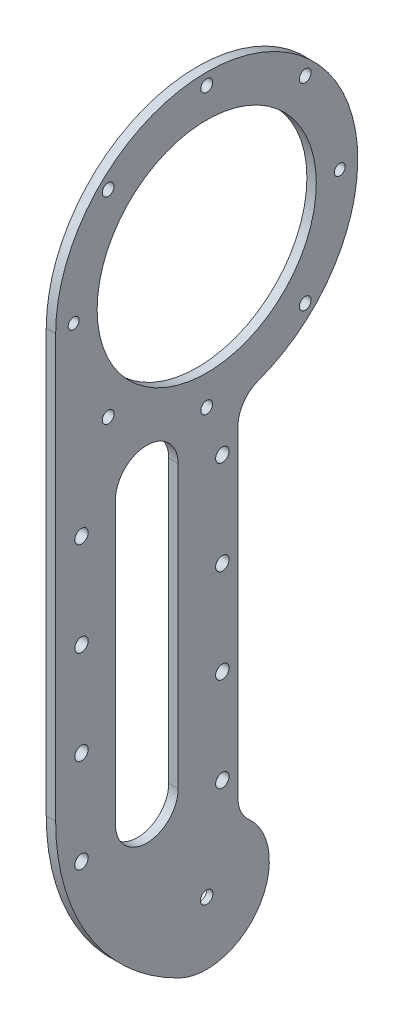
ISO-10303-21;
HEADER;
FILE_DESCRIPTION(('STEP AP214'),'2;1');
FILE_NAME('part.step','',(''),(''),'','','');
FILE_SCHEMA(('AUTOMOTIVE_DESIGN { 1 0 10303 214 1 1 1 1 }'));
ENDSEC;
DATA;
#1=APPLICATION_CONTEXT('core data for automotive mechanical design processes');
#2=APPLICATION_PROTOCOL_DEFINITION('international standard','automotive_design',2000,#1);
#3=PRODUCT_CONTEXT('',#1,'mechanical');
#4=PRODUCT('Part','Part','',(#3));
#5=PRODUCT_RELATED_PRODUCT_CATEGORY('part','',(#4));
#6=PRODUCT_DEFINITION_FORMATION('','',#4);
#7=PRODUCT_DEFINITION_CONTEXT('part definition',#1,'design');
#8=PRODUCT_DEFINITION('design','',#6,#7);
#9=PRODUCT_DEFINITION_SHAPE('','',#8);
#10=(LENGTH_UNIT() NAMED_UNIT(*) SI_UNIT(.MILLI.,.METRE.));
#11=(NAMED_UNIT(*) PLANE_ANGLE_UNIT() SI_UNIT($,.RADIAN.));
#12=(NAMED_UNIT(*) SI_UNIT($,.STERADIAN.) SOLID_ANGLE_UNIT());
#13=UNCERTAINTY_MEASURE_WITH_UNIT(LENGTH_MEASURE(1.E-05),#10,'distance_accuracy_value','');
#14=(GEOMETRIC_REPRESENTATION_CONTEXT(3) GLOBAL_UNCERTAINTY_ASSIGNED_CONTEXT((#13)) GLOBAL_UNIT_ASSIGNED_CONTEXT((#10,
#11,#12)) REPRESENTATION_CONTEXT('',''));
#15=CARTESIAN_POINT('',(0.,0.,0.));
#16=DIRECTION('',(0.,0.,1.));
#17=DIRECTION('',(1.,0.,0.));
#18=AXIS2_PLACEMENT_3D('',#15,#16,#17);
#19=CARTESIAN_POINT('',(-7.,-180.,0.));
#20=DIRECTION('',(1.,0.,0.));
#21=DIRECTION('',(0.,0.,1.));
#22=AXIS2_PLACEMENT_3D('',#19,#20,#21);
#23=CYLINDRICAL_SURFACE('',#22,2.);
#24=CARTESIAN_POINT('',(3.,-180.,0.));
#25=DIRECTION('',(-1.,0.,0.));
#26=DIRECTION('',(0.,0.,1.));
#27=AXIS2_PLACEMENT_3D('',#24,#25,#26);
#28=CIRCLE('',#27,2.);
#29=CARTESIAN_POINT('',(3.,-180.,2.));
#30=VERTEX_POINT('',#29);
#31=EDGE_CURVE('E252',#30,#30,#28,.T.);
#32=ORIENTED_EDGE('',*,*,#31,.F.);
#33=EDGE_LOOP('',(#32));
#34=FACE_BOUND('',#33,.T.);
#35=CARTESIAN_POINT('',(1.,-180.,0.));
#36=DIRECTION('',(1.,0.,0.));
#37=DIRECTION('',(0.,0.,-1.));
#38=AXIS2_PLACEMENT_3D('',#35,#36,#37);
#39=CIRCLE('',#38,2.);
#40=CARTESIAN_POINT('',(1.,-180.,-2.));
#41=VERTEX_POINT('',#40);
#42=EDGE_CURVE('E51',#41,#41,#39,.F.);
#43=ORIENTED_EDGE('',*,*,#42,.T.);
#44=EDGE_LOOP('',(#43));
#45=FACE_BOUND('',#44,.T.);
#46=ADVANCED_FACE('F47',(#34,#45),#23,.F.);
#47=CARTESIAN_POINT('',(3.,0.,0.));
#48=DIRECTION('',(-1.,0.,0.));
#49=DIRECTION('',(0.,0.,-1.));
#50=AXIS2_PLACEMENT_3D('',#47,#48,#49);
#51=CYLINDRICAL_SURFACE('',#50,48.25);
#52=CARTESIAN_POINT('',(0.,0.,0.));
#53=DIRECTION('',(-1.,0.,0.));
#54=DIRECTION('',(0.,0.,1.));
#55=AXIS2_PLACEMENT_3D('',#52,#53,#54);
#56=CIRCLE('',#55,48.25);
#57=CARTESIAN_POINT('',(0.,0.,48.2500000000173));
#58=VERTEX_POINT('',#57);
#59=CARTESIAN_POINT('',(0.,-45.3168047818908,-16.5665236051502));
#60=VERTEX_POINT('',#59);
#61=EDGE_CURVE('E259',#58,#60,#56,.T.);
#62=ORIENTED_EDGE('',*,*,#61,.F.);
#63=DIRECTION('',(1.,0.,0.));
#64=VECTOR('',#63,1.);
#65=CARTESIAN_POINT('',(0.,0.,48.2500000000173));
#66=LINE('',#65,#64);
#67=CARTESIAN_POINT('',(3.,0.,48.2500000000173));
#68=VERTEX_POINT('',#67);
#69=EDGE_CURVE('E240',#58,#68,#66,.T.);
#70=ORIENTED_EDGE('',*,*,#69,.T.);
#71=CARTESIAN_POINT('',(3.,0.,0.));
#72=DIRECTION('',(-1.,0.,0.));
#73=DIRECTION('',(0.,0.,1.));
#74=AXIS2_PLACEMENT_3D('',#71,#72,#73);
#75=CIRCLE('',#74,48.25);
#76=CARTESIAN_POINT('',(3.,-45.3168047818908,-16.5665236051502));
#77=VERTEX_POINT('',#76);
#78=EDGE_CURVE('E304',#68,#77,#75,.T.);
#79=ORIENTED_EDGE('',*,*,#78,.T.);
#80=DIRECTION('',(-1.,0.,0.));
#81=VECTOR('',#80,1.);
#82=CARTESIAN_POINT('',(3.,-45.3168047818908,-16.5665236051502));
#83=LINE('',#82,#81);
#84=EDGE_CURVE('E321',#60,#77,#83,.F.);
#85=ORIENTED_EDGE('',*,*,#84,.F.);
#86=EDGE_LOOP('',(#62,#70,#79,#85));
#87=FACE_BOUND('',#86,.T.);
#88=ADVANCED_FACE('F349',(#87),#51,.T.);
#89=CARTESIAN_POINT('',(3.,0.,0.));
#90=DIRECTION('',(1.,0.,0.));
#91=DIRECTION('',(0.,0.,1.));
#92=AXIS2_PLACEMENT_3D('',#89,#90,#91);
#93=PLANE('',#92);
#94=CARTESIAN_POINT('',(3.,-145.453012475219,19.1250000000087));
#95=DIRECTION('',(-1.,0.,0.));
#96=DIRECTION('',(0.,0.,1.));
#97=AXIS2_PLACEMENT_3D('',#94,#95,#96);
#98=CIRCLE('',#97,10.);
#99=CARTESIAN_POINT('',(3.,-145.453012475219,9.12500000000867));
#100=VERTEX_POINT('',#99);
#101=CARTESIAN_POINT('',(3.,-145.453012475219,29.1250000000087));
#102=VERTEX_POINT('',#101);
#103=EDGE_CURVE('E164',#100,#102,#98,.T.);
#104=ORIENTED_EDGE('',*,*,#103,.T.);
#105=DIRECTION('',(0.,1.,0.));
#106=VECTOR('',#105,1.);
#107=CARTESIAN_POINT('',(3.,0.,29.1250000000087));
#108=LINE('',#107,#106);
#109=CARTESIAN_POINT('',(3.,-55.4530124752191,29.1250000000087));
#110=VERTEX_POINT('',#109);
#111=EDGE_CURVE('E161',#102,#110,#108,.T.);
#112=ORIENTED_EDGE('',*,*,#111,.T.);
#113=CARTESIAN_POINT('',(3.,-55.4530124752191,19.1250000000087));
#114=DIRECTION('',(-1.,0.,0.));
#115=DIRECTION('',(0.,0.,1.));
#116=AXIS2_PLACEMENT_3D('',#113,#114,#115);
#117=CIRCLE('',#116,10.);
#118=CARTESIAN_POINT('',(3.,-55.4530124752191,9.12500000000867));
#119=VERTEX_POINT('',#118);
#120=EDGE_CURVE('E159',#110,#119,#117,.T.);
#121=ORIENTED_EDGE('',*,*,#120,.T.);
#122=DIRECTION('',(0.,-1.,0.));
#123=VECTOR('',#122,1.);
#124=CARTESIAN_POINT('',(3.,0.,9.12500000000867));
#125=LINE('',#124,#123);
#126=EDGE_CURVE('E135',#119,#100,#125,.T.);
#127=ORIENTED_EDGE('',*,*,#126,.T.);
#128=EDGE_LOOP('',(#104,#112,#121,#127));
#129=FACE_BOUND('',#128,.T.);
#130=CARTESIAN_POINT('',(3.,0.,0.));
#131=DIRECTION('',(-1.,0.,0.));
#132=DIRECTION('',(0.,0.,1.));
#133=AXIS2_PLACEMENT_3D('',#130,#131,#132);
#134=CIRCLE('',#133,35.);
#135=CARTESIAN_POINT('',(3.,0.,35.));
#136=VERTEX_POINT('',#135);
#137=EDGE_CURVE('E170',#136,#136,#134,.T.);
#138=ORIENTED_EDGE('',*,*,#137,.T.);
#139=EDGE_LOOP('',(#138));
#140=FACE_BOUND('',#139,.T.);
#141=CARTESIAN_POINT('',(3.,-150.145481745696,40.));
#142=DIRECTION('',(-1.,0.,0.));
#143=DIRECTION('',(0.,0.,1.));
#144=AXIS2_PLACEMENT_3D('',#141,#142,#143);
#145=CIRCLE('',#144,2.15);
#146=CARTESIAN_POINT('',(3.,-150.145481745696,42.15));
#147=VERTEX_POINT('',#146);
#148=EDGE_CURVE('E182',#147,#147,#145,.T.);
#149=ORIENTED_EDGE('',*,*,#148,.T.);
#150=EDGE_LOOP('',(#149));
#151=FACE_BOUND('',#150,.T.);
#152=CARTESIAN_POINT('',(3.,-120.145481745696,-5.00000000000002));
#153=DIRECTION('',(-1.,0.,0.));
#154=DIRECTION('',(0.,0.,1.));
#155=AXIS2_PLACEMENT_3D('',#152,#153,#154);
#156=CIRCLE('',#155,2.15);
#157=CARTESIAN_POINT('',(3.,-120.145481745696,-2.85000000000002));
#158=VERTEX_POINT('',#157);
#159=EDGE_CURVE('E190',#158,#158,#156,.T.);
#160=ORIENTED_EDGE('',*,*,#159,.T.);
#161=EDGE_LOOP('',(#160));
#162=FACE_BOUND('',#161,.T.);
#163=CARTESIAN_POINT('',(3.,-120.145481745696,40.));
#164=DIRECTION('',(-1.,0.,0.));
#165=DIRECTION('',(0.,0.,1.));
#166=AXIS2_PLACEMENT_3D('',#163,#164,#165);
#167=CIRCLE('',#166,2.15);
#168=CARTESIAN_POINT('',(3.,-120.145481745696,42.15));
#169=VERTEX_POINT('',#168);
#170=EDGE_CURVE('E189',#169,#169,#167,.T.);
#171=ORIENTED_EDGE('',*,*,#170,.T.);
#172=EDGE_LOOP('',(#171));
#173=FACE_BOUND('',#172,.T.);
#174=CARTESIAN_POINT('',(3.,-90.1454817456961,-5.00000000000002));
#175=DIRECTION('',(-1.,0.,0.));
#176=DIRECTION('',(0.,0.,1.));
#177=AXIS2_PLACEMENT_3D('',#174,#175,#176);
#178=CIRCLE('',#177,2.15);
#179=CARTESIAN_POINT('',(3.,-90.1454817456961,-2.85000000000002));
#180=VERTEX_POINT('',#179);
#181=EDGE_CURVE('E202',#180,#180,#178,.T.);
#182=ORIENTED_EDGE('',*,*,#181,.T.);
#183=EDGE_LOOP('',(#182));
#184=FACE_BOUND('',#183,.T.);
#185=CARTESIAN_POINT('',(3.,-150.145481745696,-5.00000000000002));
#186=DIRECTION('',(-1.,0.,0.));
#187=DIRECTION('',(0.,0.,1.));
#188=AXIS2_PLACEMENT_3D('',#185,#186,#187);
#189=CIRCLE('',#188,2.15);
#190=CARTESIAN_POINT('',(3.,-150.145481745696,-2.85000000000002));
#191=VERTEX_POINT('',#190);
#192=EDGE_CURVE('E183',#191,#191,#189,.T.);
#193=ORIENTED_EDGE('',*,*,#192,.T.);
#194=EDGE_LOOP('',(#193));
#195=FACE_BOUND('',#194,.T.);
#196=CARTESIAN_POINT('',(3.,-90.1454817456961,40.));
#197=DIRECTION('',(-1.,0.,0.));
#198=DIRECTION('',(0.,0.,1.));
#199=AXIS2_PLACEMENT_3D('',#196,#197,#198);
#200=CIRCLE('',#199,2.15);
#201=CARTESIAN_POINT('',(3.,-90.1454817456961,42.15));
#202=VERTEX_POINT('',#201);
#203=EDGE_CURVE('E201',#202,#202,#200,.T.);
#204=ORIENTED_EDGE('',*,*,#203,.T.);
#205=EDGE_LOOP('',(#204));
#206=FACE_BOUND('',#205,.T.);
#207=CARTESIAN_POINT('',(3.,-60.1454817456961,40.));
#208=DIRECTION('',(-1.,0.,0.));
#209=DIRECTION('',(0.,0.,1.));
#210=AXIS2_PLACEMENT_3D('',#207,#208,#209);
#211=CIRCLE('',#210,2.15);
#212=CARTESIAN_POINT('',(3.,-60.1454817456961,42.15));
#213=VERTEX_POINT('',#212);
#214=EDGE_CURVE('E220',#213,#213,#211,.T.);
#215=ORIENTED_EDGE('',*,*,#214,.T.);
#216=EDGE_LOOP('',(#215));
#217=FACE_BOUND('',#216,.T.);
#218=CARTESIAN_POINT('',(3.,-60.1454817456961,-5.00000000000002));
#219=DIRECTION('',(-1.,0.,0.));
#220=DIRECTION('',(0.,0.,1.));
#221=AXIS2_PLACEMENT_3D('',#218,#219,#220);
#222=CIRCLE('',#221,2.15);
#223=CARTESIAN_POINT('',(3.,-60.1454817456961,-2.85000000000002));
#224=VERTEX_POINT('',#223);
#225=EDGE_CURVE('E223',#224,#224,#222,.T.);
#226=ORIENTED_EDGE('',*,*,#225,.T.);
#227=EDGE_LOOP('',(#226));
#228=FACE_BOUND('',#227,.T.);
#229=DIRECTION('',(0.,1.,0.));
#230=VECTOR('',#229,1.);
#231=CARTESIAN_POINT('',(3.,0.,-10.));
#232=LINE('',#231,#230);
#233=CARTESIAN_POINT('',(3.,-157.639320225002,-10.));
#234=VERTEX_POINT('',#233);
#235=CARTESIAN_POINT('',(3.,-54.7088886745107,-10.));
#236=VERTEX_POINT('',#235);
#237=EDGE_CURVE('E249',#234,#236,#232,.T.);
#238=ORIENTED_EDGE('',*,*,#237,.T.);
#239=CARTESIAN_POINT('',(3.,-54.7088886745107,-20.));
#240=DIRECTION('',(-1.,0.,0.));
#241=DIRECTION('',(0.,0.,1.));
#242=AXIS2_PLACEMENT_3D('',#239,#240,#241);
#243=CIRCLE('',#242,10.);
#244=EDGE_CURVE('E56',#77,#236,#243,.F.);
#245=ORIENTED_EDGE('',*,*,#244,.F.);
#246=ORIENTED_EDGE('',*,*,#78,.F.);
#247=DIRECTION('',(0.,-1.,0.));
#248=VECTOR('',#247,1.);
#249=CARTESIAN_POINT('',(3.,0.,48.2500000000173));
#250=LINE('',#249,#248);
#251=CARTESIAN_POINT('',(3.,-134.848327691712,48.2500000000173));
#252=VERTEX_POINT('',#251);
#253=EDGE_CURVE('E232',#68,#252,#250,.T.);
#254=ORIENTED_EDGE('',*,*,#253,.T.);
#255=CARTESIAN_POINT('',(3.,-134.848327691712,-21.9577170306773));
#256=DIRECTION('',(-1.,0.,0.));
#257=DIRECTION('',(0.,0.,1.));
#258=AXIS2_PLACEMENT_3D('',#255,#256,#257);
#259=CIRCLE('',#258,70.2077170306947);
#260=CARTESIAN_POINT('',(3.,-197.985949164223,8.74674983419517));
#261=VERTEX_POINT('',#260);
#262=EDGE_CURVE('E219',#261,#252,#259,.T.);
#263=ORIENTED_EDGE('',*,*,#262,.F.);
#264=CARTESIAN_POINT('',(3.,-180.,0.));
#265=DIRECTION('',(-1.,0.,0.));
#266=DIRECTION('',(0.,0.,1.));
#267=AXIS2_PLACEMENT_3D('',#264,#265,#266);
#268=CIRCLE('',#267,20.);
#269=CARTESIAN_POINT('',(3.,-165.092880150001,-13.3333333333333));
#270=VERTEX_POINT('',#269);
#271=EDGE_CURVE('E243',#270,#261,#268,.T.);
#272=ORIENTED_EDGE('',*,*,#271,.F.);
#273=CARTESIAN_POINT('',(3.,-157.639320225002,-20.));
#274=DIRECTION('',(-1.,0.,0.));
#275=DIRECTION('',(0.,0.,1.));
#276=AXIS2_PLACEMENT_3D('',#273,#274,#275);
#277=CIRCLE('',#276,10.);
#278=EDGE_CURVE('E324',#234,#270,#277,.F.);
#279=ORIENTED_EDGE('',*,*,#278,.F.);
#280=EDGE_LOOP('',(#238,#245,#246,#254,#263,#272,#279));
#281=FACE_BOUND('',#280,.T.);
#282=CARTESIAN_POINT('',(3.,0.,-42.5));
#283=DIRECTION('',(-1.,0.,0.));
#284=DIRECTION('',(0.,0.,1.));
#285=AXIS2_PLACEMENT_3D('',#282,#283,#284);
#286=CIRCLE('',#285,1.75);
#287=CARTESIAN_POINT('',(3.,0.,-40.75));
#288=VERTEX_POINT('',#287);
#289=EDGE_CURVE('E256',#288,#288,#286,.T.);
#290=ORIENTED_EDGE('',*,*,#289,.T.);
#291=EDGE_LOOP('',(#290));
#292=FACE_BOUND('',#291,.T.);
#293=CARTESIAN_POINT('',(3.,31.4662517628014,-31.4662517628014));
#294=DIRECTION('',(-1.,0.,0.));
#295=DIRECTION('',(0.,0.,1.));
#296=AXIS2_PLACEMENT_3D('',#293,#294,#295);
#297=CIRCLE('',#296,1.90000000000273);
#298=CARTESIAN_POINT('',(3.,31.4662517628014,-29.5662517627986));
#299=VERTEX_POINT('',#298);
#300=EDGE_CURVE('E255',#299,#299,#297,.T.);
#301=ORIENTED_EDGE('',*,*,#300,.T.);
#302=EDGE_LOOP('',(#301));
#303=FACE_BOUND('',#302,.T.);
#304=CARTESIAN_POINT('',(3.,-31.4662517628014,-31.4662517628014));
#305=DIRECTION('',(-1.,0.,0.));
#306=DIRECTION('',(0.,0.,1.));
#307=AXIS2_PLACEMENT_3D('',#304,#305,#306);
#308=CIRCLE('',#307,1.90000000000259);
#309=CARTESIAN_POINT('',(3.,-31.4662517628014,-29.5662517627988));
#310=VERTEX_POINT('',#309);
#311=EDGE_CURVE('E274',#310,#310,#308,.T.);
#312=ORIENTED_EDGE('',*,*,#311,.T.);
#313=EDGE_LOOP('',(#312));
#314=FACE_BOUND('',#313,.T.);
#315=CARTESIAN_POINT('',(3.,-44.5,0.));
#316=DIRECTION('',(-1.,0.,0.));
#317=DIRECTION('',(0.,0.,1.));
#318=AXIS2_PLACEMENT_3D('',#315,#316,#317);
#319=CIRCLE('',#318,1.90000000000251);
#320=CARTESIAN_POINT('',(3.,-44.5,1.90000000000252));
#321=VERTEX_POINT('',#320);
#322=EDGE_CURVE('E268',#321,#321,#319,.T.);
#323=ORIENTED_EDGE('',*,*,#322,.T.);
#324=EDGE_LOOP('',(#323));
#325=FACE_BOUND('',#324,.T.);
#326=CARTESIAN_POINT('',(3.,44.5,0.));
#327=DIRECTION('',(-1.,0.,0.));
#328=DIRECTION('',(0.,0.,1.));
#329=AXIS2_PLACEMENT_3D('',#326,#327,#328);
#330=CIRCLE('',#329,1.90000000000221);
#331=CARTESIAN_POINT('',(3.,44.5,1.90000000000221));
#332=VERTEX_POINT('',#331);
#333=EDGE_CURVE('E296',#332,#332,#330,.T.);
#334=ORIENTED_EDGE('',*,*,#333,.T.);
#335=EDGE_LOOP('',(#334));
#336=FACE_BOUND('',#335,.T.);
#337=CARTESIAN_POINT('',(3.,0.,42.5));
#338=DIRECTION('',(-1.,0.,0.));
#339=DIRECTION('',(0.,0.,-1.));
#340=AXIS2_PLACEMENT_3D('',#337,#338,#339);
#341=CIRCLE('',#340,1.75);
#342=CARTESIAN_POINT('',(3.,0.,40.75));
#343=VERTEX_POINT('',#342);
#344=EDGE_CURVE('E285',#343,#343,#341,.T.);
#345=ORIENTED_EDGE('',*,*,#344,.T.);
#346=EDGE_LOOP('',(#345));
#347=FACE_BOUND('',#346,.T.);
#348=CARTESIAN_POINT('',(3.,31.4662517628014,31.4662517628014));
#349=DIRECTION('',(-1.,0.,0.));
#350=DIRECTION('',(0.,0.,1.));
#351=AXIS2_PLACEMENT_3D('',#348,#349,#350);
#352=CIRCLE('',#351,1.90000000000228);
#353=CARTESIAN_POINT('',(3.,31.4662517628014,33.3662517628036));
#354=VERTEX_POINT('',#353);
#355=EDGE_CURVE('E286',#354,#354,#352,.T.);
#356=ORIENTED_EDGE('',*,*,#355,.T.);
#357=EDGE_LOOP('',(#356));
#358=FACE_BOUND('',#357,.T.);
#359=CARTESIAN_POINT('',(3.,-31.4662517628014,31.4662517628014));
#360=DIRECTION('',(-1.,0.,0.));
#361=DIRECTION('',(0.,0.,1.));
#362=AXIS2_PLACEMENT_3D('',#359,#360,#361);
#363=CIRCLE('',#362,1.90000000000243);
#364=CARTESIAN_POINT('',(3.,-31.4662517628014,33.3662517628038));
#365=VERTEX_POINT('',#364);
#366=EDGE_CURVE('E267',#365,#365,#363,.T.);
#367=ORIENTED_EDGE('',*,*,#366,.T.);
#368=EDGE_LOOP('',(#367));
#369=FACE_BOUND('',#368,.T.);
#370=ORIENTED_EDGE('',*,*,#31,.T.);
#371=EDGE_LOOP('',(#370));
#372=FACE_BOUND('',#371,.T.);
#373=ADVANCED_FACE('F337',(#129,#140,#151,#162,#173,#184,#195,#206,#217,#228,#281,#292,#303,
#314,#325,#336,#347,#358,#369,#372),#93,.T.);
#374=CARTESIAN_POINT('',(0.,0.,0.));
#375=DIRECTION('',(1.,0.,0.));
#376=DIRECTION('',(0.,0.,1.));
#377=AXIS2_PLACEMENT_3D('',#374,#375,#376);
#378=PLANE('',#377);
#379=DIRECTION('',(0.,1.,0.));
#380=VECTOR('',#379,1.);
#381=CARTESIAN_POINT('',(0.,-145.453012475219,9.12500000000867));
#382=LINE('',#381,#380);
#383=CARTESIAN_POINT('',(0.,-145.453012475219,9.12500000000867));
#384=VERTEX_POINT('',#383);
#385=CARTESIAN_POINT('',(0.,-55.4530124752191,9.12500000000867));
#386=VERTEX_POINT('',#385);
#387=EDGE_CURVE('E133',#384,#386,#382,.T.);
#388=ORIENTED_EDGE('',*,*,#387,.T.);
#389=CARTESIAN_POINT('',(0.,-55.4530124752191,19.1250000000087));
#390=DIRECTION('',(1.,0.,0.));
#391=DIRECTION('',(0.,0.,-1.));
#392=AXIS2_PLACEMENT_3D('',#389,#390,#391);
#393=CIRCLE('',#392,10.);
#394=CARTESIAN_POINT('',(0.,-55.4530124752191,29.1250000000087));
#395=VERTEX_POINT('',#394);
#396=EDGE_CURVE('E140',#386,#395,#393,.T.);
#397=ORIENTED_EDGE('',*,*,#396,.T.);
#398=DIRECTION('',(0.,-1.,0.));
#399=VECTOR('',#398,1.);
#400=CARTESIAN_POINT('',(0.,-145.453012475219,29.1250000000087));
#401=LINE('',#400,#399);
#402=CARTESIAN_POINT('',(0.,-145.453012475219,29.1250000000087));
#403=VERTEX_POINT('',#402);
#404=EDGE_CURVE('E145',#395,#403,#401,.T.);
#405=ORIENTED_EDGE('',*,*,#404,.T.);
#406=CARTESIAN_POINT('',(0.,-145.453012475219,19.1250000000087));
#407=DIRECTION('',(1.,0.,0.));
#408=DIRECTION('',(0.,0.,-1.));
#409=AXIS2_PLACEMENT_3D('',#406,#407,#408);
#410=CIRCLE('',#409,10.);
#411=EDGE_CURVE('E149',#403,#384,#410,.T.);
#412=ORIENTED_EDGE('',*,*,#411,.T.);
#413=EDGE_LOOP('',(#388,#397,#405,#412));
#414=FACE_BOUND('',#413,.T.);
#415=CARTESIAN_POINT('',(0.,0.,0.));
#416=DIRECTION('',(1.,0.,0.));
#417=DIRECTION('',(0.,0.,-1.));
#418=AXIS2_PLACEMENT_3D('',#415,#416,#417);
#419=CIRCLE('',#418,35.);
#420=CARTESIAN_POINT('',(0.,0.,-35.));
#421=VERTEX_POINT('',#420);
#422=EDGE_CURVE('E167',#421,#421,#419,.T.);
#423=ORIENTED_EDGE('',*,*,#422,.T.);
#424=EDGE_LOOP('',(#423));
#425=FACE_BOUND('',#424,.T.);
#426=CARTESIAN_POINT('',(0.,-180.,0.));
#427=DIRECTION('',(1.,0.,0.));
#428=DIRECTION('',(0.,0.,-1.));
#429=AXIS2_PLACEMENT_3D('',#426,#427,#428);
#430=CIRCLE('',#429,5.);
#431=CARTESIAN_POINT('',(0.,-180.,-5.));
#432=VERTEX_POINT('',#431);
#433=EDGE_CURVE('E173',#432,#432,#430,.T.);
#434=ORIENTED_EDGE('',*,*,#433,.T.);
#435=EDGE_LOOP('',(#434));
#436=FACE_BOUND('',#435,.T.);
#437=CARTESIAN_POINT('',(0.,-150.145481745696,40.));
#438=DIRECTION('',(-1.,0.,0.));
#439=DIRECTION('',(0.,0.,1.));
#440=AXIS2_PLACEMENT_3D('',#437,#438,#439);
#441=CIRCLE('',#440,2.15);
#442=CARTESIAN_POINT('',(0.,-150.145481745696,42.15));
#443=VERTEX_POINT('',#442);
#444=EDGE_CURVE('E193',#443,#443,#441,.T.);
#445=ORIENTED_EDGE('',*,*,#444,.F.);
#446=EDGE_LOOP('',(#445));
#447=FACE_BOUND('',#446,.T.);
#448=CARTESIAN_POINT('',(0.,-120.145481745696,-5.00000000000002));
#449=DIRECTION('',(-1.,0.,0.));
#450=DIRECTION('',(0.,0.,1.));
#451=AXIS2_PLACEMENT_3D('',#448,#449,#450);
#452=CIRCLE('',#451,2.15);
#453=CARTESIAN_POINT('',(0.,-120.145481745696,-2.85000000000002));
#454=VERTEX_POINT('',#453);
#455=EDGE_CURVE('E186',#454,#454,#452,.T.);
#456=ORIENTED_EDGE('',*,*,#455,.F.);
#457=EDGE_LOOP('',(#456));
#458=FACE_BOUND('',#457,.T.);
#459=CARTESIAN_POINT('',(0.,-120.145481745696,40.));
#460=DIRECTION('',(-1.,0.,0.));
#461=DIRECTION('',(0.,0.,1.));
#462=AXIS2_PLACEMENT_3D('',#459,#460,#461);
#463=CIRCLE('',#462,2.15);
#464=CARTESIAN_POINT('',(0.,-120.145481745696,42.15));
#465=VERTEX_POINT('',#464);
#466=EDGE_CURVE('E205',#465,#465,#463,.T.);
#467=ORIENTED_EDGE('',*,*,#466,.F.);
#468=EDGE_LOOP('',(#467));
#469=FACE_BOUND('',#468,.T.);
#470=CARTESIAN_POINT('',(0.,-90.1454817456961,-5.00000000000002));
#471=DIRECTION('',(-1.,0.,0.));
#472=DIRECTION('',(0.,0.,1.));
#473=AXIS2_PLACEMENT_3D('',#470,#471,#472);
#474=CIRCLE('',#473,2.15);
#475=CARTESIAN_POINT('',(0.,-90.1454817456961,-2.85000000000002));
#476=VERTEX_POINT('',#475);
#477=EDGE_CURVE('E198',#476,#476,#474,.T.);
#478=ORIENTED_EDGE('',*,*,#477,.F.);
#479=EDGE_LOOP('',(#478));
#480=FACE_BOUND('',#479,.T.);
#481=CARTESIAN_POINT('',(0.,-150.145481745696,-5.00000000000002));
#482=DIRECTION('',(-1.,0.,0.));
#483=DIRECTION('',(0.,0.,1.));
#484=AXIS2_PLACEMENT_3D('',#481,#482,#483);
#485=CIRCLE('',#484,2.15);
#486=CARTESIAN_POINT('',(0.,-150.145481745696,-2.85000000000002));
#487=VERTEX_POINT('',#486);
#488=EDGE_CURVE('E179',#487,#487,#485,.T.);
#489=ORIENTED_EDGE('',*,*,#488,.F.);
#490=EDGE_LOOP('',(#489));
#491=FACE_BOUND('',#490,.T.);
#492=CARTESIAN_POINT('',(0.,-90.1454817456961,40.));
#493=DIRECTION('',(-1.,0.,0.));
#494=DIRECTION('',(0.,0.,1.));
#495=AXIS2_PLACEMENT_3D('',#492,#493,#494);
#496=CIRCLE('',#495,2.15);
#497=CARTESIAN_POINT('',(0.,-90.1454817456961,42.15));
#498=VERTEX_POINT('',#497);
#499=EDGE_CURVE('E210',#498,#498,#496,.T.);
#500=ORIENTED_EDGE('',*,*,#499,.F.);
#501=EDGE_LOOP('',(#500));
#502=FACE_BOUND('',#501,.T.);
#503=CARTESIAN_POINT('',(0.,-60.1454817456961,40.));
#504=DIRECTION('',(-1.,0.,0.));
#505=DIRECTION('',(0.,0.,1.));
#506=AXIS2_PLACEMENT_3D('',#503,#504,#505);
#507=CIRCLE('',#506,2.15);
#508=CARTESIAN_POINT('',(0.,-60.1454817456961,42.15));
#509=VERTEX_POINT('',#508);
#510=EDGE_CURVE('E216',#509,#509,#507,.T.);
#511=ORIENTED_EDGE('',*,*,#510,.F.);
#512=EDGE_LOOP('',(#511));
#513=FACE_BOUND('',#512,.T.);
#514=CARTESIAN_POINT('',(0.,-60.1454817456961,-5.00000000000002));
#515=DIRECTION('',(-1.,0.,0.));
#516=DIRECTION('',(0.,0.,1.));
#517=AXIS2_PLACEMENT_3D('',#514,#515,#516);
#518=CIRCLE('',#517,2.15);
#519=CARTESIAN_POINT('',(0.,-60.1454817456961,-2.85000000000002));
#520=VERTEX_POINT('',#519);
#521=EDGE_CURVE('E213',#520,#520,#518,.T.);
#522=ORIENTED_EDGE('',*,*,#521,.F.);
#523=EDGE_LOOP('',(#522));
#524=FACE_BOUND('',#523,.T.);
#525=CARTESIAN_POINT('',(0.,-134.848327691712,-21.9577170306773));
#526=DIRECTION('',(-1.,0.,0.));
#527=DIRECTION('',(0.,0.,1.));
#528=AXIS2_PLACEMENT_3D('',#525,#526,#527);
#529=CIRCLE('',#528,70.2077170306947);
#530=CARTESIAN_POINT('',(0.,-197.985949164223,8.74674983419517));
#531=VERTEX_POINT('',#530);
#532=CARTESIAN_POINT('',(0.,-134.848327691712,48.2500000000173));
#533=VERTEX_POINT('',#532);
#534=EDGE_CURVE('E228',#531,#533,#529,.T.);
#535=ORIENTED_EDGE('',*,*,#534,.T.);
#536=DIRECTION('',(0.,-1.,0.));
#537=VECTOR('',#536,1.);
#538=CARTESIAN_POINT('',(0.,0.,48.2500000000173));
#539=LINE('',#538,#537);
#540=EDGE_CURVE('E231',#58,#533,#539,.T.);
#541=ORIENTED_EDGE('',*,*,#540,.F.);
#542=ORIENTED_EDGE('',*,*,#61,.T.);
#543=CARTESIAN_POINT('',(0.,-54.7088886745107,-20.));
#544=DIRECTION('',(-1.,0.,0.));
#545=DIRECTION('',(0.,0.,1.));
#546=AXIS2_PLACEMENT_3D('',#543,#544,#545);
#547=CIRCLE('',#546,10.);
#548=CARTESIAN_POINT('',(0.,-54.7088886745107,-10.));
#549=VERTEX_POINT('',#548);
#550=EDGE_CURVE('E11',#549,#60,#547,.T.);
#551=ORIENTED_EDGE('',*,*,#550,.F.);
#552=DIRECTION('',(0.,1.,0.));
#553=VECTOR('',#552,1.);
#554=CARTESIAN_POINT('',(0.,0.,-10.));
#555=LINE('',#554,#553);
#556=CARTESIAN_POINT('',(0.,-157.639320225002,-10.));
#557=VERTEX_POINT('',#556);
#558=EDGE_CURVE('E307',#557,#549,#555,.T.);
#559=ORIENTED_EDGE('',*,*,#558,.F.);
#560=CARTESIAN_POINT('',(0.,-157.639320225002,-20.));
#561=DIRECTION('',(-1.,0.,0.));
#562=DIRECTION('',(0.,0.,1.));
#563=AXIS2_PLACEMENT_3D('',#560,#561,#562);
#564=CIRCLE('',#563,10.);
#565=CARTESIAN_POINT('',(0.,-165.092880150001,-13.3333333333333));
#566=VERTEX_POINT('',#565);
#567=EDGE_CURVE('E327',#566,#557,#564,.T.);
#568=ORIENTED_EDGE('',*,*,#567,.F.);
#569=CARTESIAN_POINT('',(0.,-180.,0.));
#570=DIRECTION('',(-1.,0.,0.));
#571=DIRECTION('',(0.,0.,1.));
#572=AXIS2_PLACEMENT_3D('',#569,#570,#571);
#573=CIRCLE('',#572,20.);
#574=EDGE_CURVE('E312',#566,#531,#573,.T.);
#575=ORIENTED_EDGE('',*,*,#574,.T.);
#576=EDGE_LOOP('',(#535,#541,#542,#551,#559,#568,#575));
#577=FACE_BOUND('',#576,.T.);
#578=CARTESIAN_POINT('',(0.,0.,-42.5));
#579=DIRECTION('',(-1.,0.,0.));
#580=DIRECTION('',(0.,0.,1.));
#581=AXIS2_PLACEMENT_3D('',#578,#579,#580);
#582=CIRCLE('',#581,1.75);
#583=CARTESIAN_POINT('',(0.,0.,-40.75));
#584=VERTEX_POINT('',#583);
#585=EDGE_CURVE('E260',#584,#584,#582,.T.);
#586=ORIENTED_EDGE('',*,*,#585,.F.);
#587=EDGE_LOOP('',(#586));
#588=FACE_BOUND('',#587,.T.);
#589=CARTESIAN_POINT('',(0.,31.4662517628014,-31.4662517628014));
#590=DIRECTION('',(-1.,0.,0.));
#591=DIRECTION('',(0.,0.,1.));
#592=AXIS2_PLACEMENT_3D('',#589,#590,#591);
#593=CIRCLE('',#592,1.90000000000273);
#594=CARTESIAN_POINT('',(0.,31.4662517628014,-29.5662517627986));
#595=VERTEX_POINT('',#594);
#596=EDGE_CURVE('E277',#595,#595,#593,.T.);
#597=ORIENTED_EDGE('',*,*,#596,.F.);
#598=EDGE_LOOP('',(#597));
#599=FACE_BOUND('',#598,.T.);
#600=CARTESIAN_POINT('',(0.,-31.4662517628014,-31.4662517628014));
#601=DIRECTION('',(-1.,0.,0.));
#602=DIRECTION('',(0.,0.,1.));
#603=AXIS2_PLACEMENT_3D('',#600,#601,#602);
#604=CIRCLE('',#603,1.90000000000259);
#605=CARTESIAN_POINT('',(0.,-31.4662517628014,-29.5662517627988));
#606=VERTEX_POINT('',#605);
#607=EDGE_CURVE('E271',#606,#606,#604,.T.);
#608=ORIENTED_EDGE('',*,*,#607,.F.);
#609=EDGE_LOOP('',(#608));
#610=FACE_BOUND('',#609,.T.);
#611=CARTESIAN_POINT('',(0.,-44.5,0.));
#612=DIRECTION('',(-1.,0.,0.));
#613=DIRECTION('',(0.,0.,1.));
#614=AXIS2_PLACEMENT_3D('',#611,#612,#613);
#615=CIRCLE('',#614,1.90000000000251);
#616=CARTESIAN_POINT('',(0.,-44.5,1.90000000000252));
#617=VERTEX_POINT('',#616);
#618=EDGE_CURVE('E264',#617,#617,#615,.T.);
#619=ORIENTED_EDGE('',*,*,#618,.F.);
#620=EDGE_LOOP('',(#619));
#621=FACE_BOUND('',#620,.T.);
#622=CARTESIAN_POINT('',(0.,44.5,0.));
#623=DIRECTION('',(-1.,0.,0.));
#624=DIRECTION('',(0.,0.,1.));
#625=AXIS2_PLACEMENT_3D('',#622,#623,#624);
#626=CIRCLE('',#625,1.90000000000221);
#627=CARTESIAN_POINT('',(0.,44.5,1.90000000000221));
#628=VERTEX_POINT('',#627);
#629=EDGE_CURVE('E263',#628,#628,#626,.T.);
#630=ORIENTED_EDGE('',*,*,#629,.F.);
#631=EDGE_LOOP('',(#630));
#632=FACE_BOUND('',#631,.T.);
#633=CARTESIAN_POINT('',(0.,0.,42.5));
#634=DIRECTION('',(-1.,0.,0.));
#635=DIRECTION('',(0.,0.,-1.));
#636=AXIS2_PLACEMENT_3D('',#633,#634,#635);
#637=CIRCLE('',#636,1.75);
#638=CARTESIAN_POINT('',(0.,0.,40.75));
#639=VERTEX_POINT('',#638);
#640=EDGE_CURVE('E299',#639,#639,#637,.T.);
#641=ORIENTED_EDGE('',*,*,#640,.F.);
#642=EDGE_LOOP('',(#641));
#643=FACE_BOUND('',#642,.T.);
#644=CARTESIAN_POINT('',(0.,31.4662517628014,31.4662517628014));
#645=DIRECTION('',(-1.,0.,0.));
#646=DIRECTION('',(0.,0.,1.));
#647=AXIS2_PLACEMENT_3D('',#644,#645,#646);
#648=CIRCLE('',#647,1.90000000000228);
#649=CARTESIAN_POINT('',(0.,31.4662517628014,33.3662517628036));
#650=VERTEX_POINT('',#649);
#651=EDGE_CURVE('E282',#650,#650,#648,.T.);
#652=ORIENTED_EDGE('',*,*,#651,.F.);
#653=EDGE_LOOP('',(#652));
#654=FACE_BOUND('',#653,.T.);
#655=CARTESIAN_POINT('',(0.,-31.4662517628014,31.4662517628014));
#656=DIRECTION('',(-1.,0.,0.));
#657=DIRECTION('',(0.,0.,1.));
#658=AXIS2_PLACEMENT_3D('',#655,#656,#657);
#659=CIRCLE('',#658,1.90000000000243);
#660=CARTESIAN_POINT('',(0.,-31.4662517628014,33.3662517628038));
#661=VERTEX_POINT('',#660);
#662=EDGE_CURVE('E289',#661,#661,#659,.T.);
#663=ORIENTED_EDGE('',*,*,#662,.F.);
#664=EDGE_LOOP('',(#663));
#665=FACE_BOUND('',#664,.T.);
#666=ADVANCED_FACE('F147',(#414,#425,#436,#447,#458,#469,#480,#491,#502,#513,#524,#577,#588,
#599,#610,#621,#632,#643,#654,#665),#378,.F.);
#667=CARTESIAN_POINT('',(3.,-31.4662517628014,31.4662517628014));
#668=DIRECTION('',(-1.,0.,0.));
#669=DIRECTION('',(0.,0.,-1.));
#670=AXIS2_PLACEMENT_3D('',#667,#668,#669);
#671=CYLINDRICAL_SURFACE('',#670,1.90000000000243);
#672=ORIENTED_EDGE('',*,*,#366,.F.);
#673=EDGE_LOOP('',(#672));
#674=FACE_BOUND('',#673,.T.);
#675=ORIENTED_EDGE('',*,*,#662,.T.);
#676=EDGE_LOOP('',(#675));
#677=FACE_BOUND('',#676,.T.);
#678=ADVANCED_FACE('F402',(#674,#677),#671,.F.);
#679=CARTESIAN_POINT('',(3.,31.4662517628014,31.4662517628014));
#680=DIRECTION('',(-1.,0.,0.));
#681=DIRECTION('',(0.,0.,-1.));
#682=AXIS2_PLACEMENT_3D('',#679,#680,#681);
#683=CYLINDRICAL_SURFACE('',#682,1.90000000000228);
#684=ORIENTED_EDGE('',*,*,#355,.F.);
#685=EDGE_LOOP('',(#684));
#686=FACE_BOUND('',#685,.T.);
#687=ORIENTED_EDGE('',*,*,#651,.T.);
#688=EDGE_LOOP('',(#687));
#689=FACE_BOUND('',#688,.T.);
#690=ADVANCED_FACE('F398',(#686,#689),#683,.F.);
#691=CARTESIAN_POINT('',(3.,0.,42.5));
#692=DIRECTION('',(-1.,0.,0.));
#693=DIRECTION('',(0.,0.,-1.));
#694=AXIS2_PLACEMENT_3D('',#691,#692,#693);
#695=CYLINDRICAL_SURFACE('',#694,1.75);
#696=ORIENTED_EDGE('',*,*,#344,.F.);
#697=EDGE_LOOP('',(#696));
#698=FACE_BOUND('',#697,.T.);
#699=ORIENTED_EDGE('',*,*,#640,.T.);
#700=EDGE_LOOP('',(#699));
#701=FACE_BOUND('',#700,.T.);
#702=ADVANCED_FACE('F401',(#698,#701),#695,.F.);
#703=CARTESIAN_POINT('',(3.,44.5,0.));
#704=DIRECTION('',(-1.,0.,0.));
#705=DIRECTION('',(0.,0.,-1.));
#706=AXIS2_PLACEMENT_3D('',#703,#704,#705);
#707=CYLINDRICAL_SURFACE('',#706,1.90000000000221);
#708=ORIENTED_EDGE('',*,*,#333,.F.);
#709=EDGE_LOOP('',(#708));
#710=FACE_BOUND('',#709,.T.);
#711=ORIENTED_EDGE('',*,*,#629,.T.);
#712=EDGE_LOOP('',(#711));
#713=FACE_BOUND('',#712,.T.);
#714=ADVANCED_FACE('F390',(#710,#713),#707,.F.);
#715=CARTESIAN_POINT('',(3.,-44.5,0.));
#716=DIRECTION('',(-1.,0.,0.));
#717=DIRECTION('',(0.,0.,-1.));
#718=AXIS2_PLACEMENT_3D('',#715,#716,#717);
#719=CYLINDRICAL_SURFACE('',#718,1.90000000000251);
#720=ORIENTED_EDGE('',*,*,#322,.F.);
#721=EDGE_LOOP('',(#720));
#722=FACE_BOUND('',#721,.T.);
#723=ORIENTED_EDGE('',*,*,#618,.T.);
#724=EDGE_LOOP('',(#723));
#725=FACE_BOUND('',#724,.T.);
#726=ADVANCED_FACE('F386',(#722,#725),#719,.F.);
#727=CARTESIAN_POINT('',(3.,-31.4662517628014,-31.4662517628014));
#728=DIRECTION('',(-1.,0.,0.));
#729=DIRECTION('',(0.,0.,-1.));
#730=AXIS2_PLACEMENT_3D('',#727,#728,#729);
#731=CYLINDRICAL_SURFACE('',#730,1.90000000000259);
#732=ORIENTED_EDGE('',*,*,#311,.F.);
#733=EDGE_LOOP('',(#732));
#734=FACE_BOUND('',#733,.T.);
#735=ORIENTED_EDGE('',*,*,#607,.T.);
#736=EDGE_LOOP('',(#735));
#737=FACE_BOUND('',#736,.T.);
#738=ADVANCED_FACE('F389',(#734,#737),#731,.F.);
#739=CARTESIAN_POINT('',(3.,31.4662517628014,-31.4662517628014));
#740=DIRECTION('',(-1.,0.,0.));
#741=DIRECTION('',(0.,0.,-1.));
#742=AXIS2_PLACEMENT_3D('',#739,#740,#741);
#743=CYLINDRICAL_SURFACE('',#742,1.90000000000273);
#744=ORIENTED_EDGE('',*,*,#300,.F.);
#745=EDGE_LOOP('',(#744));
#746=FACE_BOUND('',#745,.T.);
#747=ORIENTED_EDGE('',*,*,#596,.T.);
#748=EDGE_LOOP('',(#747));
#749=FACE_BOUND('',#748,.T.);
#750=ADVANCED_FACE('F384',(#746,#749),#743,.F.);
#751=CARTESIAN_POINT('',(3.,0.,-42.5));
#752=DIRECTION('',(-1.,0.,0.));
#753=DIRECTION('',(0.,0.,-1.));
#754=AXIS2_PLACEMENT_3D('',#751,#752,#753);
#755=CYLINDRICAL_SURFACE('',#754,1.75);
#756=ORIENTED_EDGE('',*,*,#289,.F.);
#757=EDGE_LOOP('',(#756));
#758=FACE_BOUND('',#757,.T.);
#759=ORIENTED_EDGE('',*,*,#585,.T.);
#760=EDGE_LOOP('',(#759));
#761=FACE_BOUND('',#760,.T.);
#762=ADVANCED_FACE('F381',(#758,#761),#755,.F.);
#763=CARTESIAN_POINT('',(-7.,0.,-10.));
#764=DIRECTION('',(0.,0.,1.));
#765=DIRECTION('',(0.,1.,0.));
#766=AXIS2_PLACEMENT_3D('',#763,#764,#765);
#767=PLANE('',#766);
#768=ORIENTED_EDGE('',*,*,#558,.T.);
#769=DIRECTION('',(1.,0.,0.));
#770=VECTOR('',#769,1.);
#771=CARTESIAN_POINT('',(0.,-54.7088886745107,-10.));
#772=LINE('',#771,#770);
#773=EDGE_CURVE('E315',#236,#549,#772,.F.);
#774=ORIENTED_EDGE('',*,*,#773,.F.);
#775=ORIENTED_EDGE('',*,*,#237,.F.);
#776=DIRECTION('',(1.,0.,0.));
#777=VECTOR('',#776,1.);
#778=CARTESIAN_POINT('',(-7.,-157.639320225002,-10.));
#779=LINE('',#778,#777);
#780=EDGE_CURVE('E317',#557,#234,#779,.T.);
#781=ORIENTED_EDGE('',*,*,#780,.F.);
#782=EDGE_LOOP('',(#768,#774,#775,#781));
#783=FACE_BOUND('',#782,.T.);
#784=ADVANCED_FACE('F341',(#783),#767,.F.);
#785=CARTESIAN_POINT('',(-7.,-180.,0.));
#786=DIRECTION('',(1.,0.,0.));
#787=DIRECTION('',(0.,0.,1.));
#788=AXIS2_PLACEMENT_3D('',#785,#786,#787);
#789=CYLINDRICAL_SURFACE('',#788,20.);
#790=ORIENTED_EDGE('',*,*,#271,.T.);
#791=DIRECTION('',(1.,0.,0.));
#792=VECTOR('',#791,1.);
#793=CARTESIAN_POINT('',(0.,-197.985949164223,8.74674983419517));
#794=LINE('',#793,#792);
#795=EDGE_CURVE('E235',#531,#261,#794,.T.);
#796=ORIENTED_EDGE('',*,*,#795,.F.);
#797=ORIENTED_EDGE('',*,*,#574,.F.);
#798=DIRECTION('',(1.,0.,0.));
#799=VECTOR('',#798,1.);
#800=CARTESIAN_POINT('',(-7.,-165.092880150001,-13.3333333333333));
#801=LINE('',#800,#799);
#802=EDGE_CURVE('E319',#270,#566,#801,.F.);
#803=ORIENTED_EDGE('',*,*,#802,.F.);
#804=EDGE_LOOP('',(#790,#796,#797,#803));
#805=FACE_BOUND('',#804,.T.);
#806=ADVANCED_FACE('F359',(#805),#789,.T.);
#807=CARTESIAN_POINT('',(0.,0.,48.2500000000173));
#808=DIRECTION('',(0.,0.,-1.));
#809=DIRECTION('',(1.,0.,0.));
#810=AXIS2_PLACEMENT_3D('',#807,#808,#809);
#811=PLANE('',#810);
#812=ORIENTED_EDGE('',*,*,#253,.F.);
#813=ORIENTED_EDGE('',*,*,#69,.F.);
#814=ORIENTED_EDGE('',*,*,#540,.T.);
#815=DIRECTION('',(1.,0.,0.));
#816=VECTOR('',#815,1.);
#817=CARTESIAN_POINT('',(0.,-134.848327691712,48.2500000000173));
#818=LINE('',#817,#816);
#819=EDGE_CURVE('E244',#533,#252,#818,.T.);
#820=ORIENTED_EDGE('',*,*,#819,.T.);
#821=EDGE_LOOP('',(#812,#813,#814,#820));
#822=FACE_BOUND('',#821,.T.);
#823=ADVANCED_FACE('F353',(#822),#811,.F.);
#824=CARTESIAN_POINT('',(0.,-134.848327691712,-21.9577170306773));
#825=DIRECTION('',(1.,0.,0.));
#826=DIRECTION('',(0.,0.,1.));
#827=AXIS2_PLACEMENT_3D('',#824,#825,#826);
#828=CYLINDRICAL_SURFACE('',#827,70.2077170306947);
#829=ORIENTED_EDGE('',*,*,#262,.T.);
#830=ORIENTED_EDGE('',*,*,#819,.F.);
#831=ORIENTED_EDGE('',*,*,#534,.F.);
#832=ORIENTED_EDGE('',*,*,#795,.T.);
#833=EDGE_LOOP('',(#829,#830,#831,#832));
#834=FACE_BOUND('',#833,.T.);
#835=ADVANCED_FACE('F356',(#834),#828,.T.);
#836=CARTESIAN_POINT('',(-7.,-157.639320225002,-20.));
#837=DIRECTION('',(1.,0.,0.));
#838=DIRECTION('',(0.,0.,1.));
#839=AXIS2_PLACEMENT_3D('',#836,#837,#838);
#840=CYLINDRICAL_SURFACE('',#839,10.);
#841=ORIENTED_EDGE('',*,*,#567,.T.);
#842=ORIENTED_EDGE('',*,*,#780,.T.);
#843=ORIENTED_EDGE('',*,*,#278,.T.);
#844=ORIENTED_EDGE('',*,*,#802,.T.);
#845=EDGE_LOOP('',(#841,#842,#843,#844));
#846=FACE_BOUND('',#845,.T.);
#847=ADVANCED_FACE('F361',(#846),#840,.F.);
#848=CARTESIAN_POINT('',(3.,-54.7088886745107,-20.));
#849=DIRECTION('',(-1.,0.,0.));
#850=DIRECTION('',(0.,0.,-1.));
#851=AXIS2_PLACEMENT_3D('',#848,#849,#850);
#852=CYLINDRICAL_SURFACE('',#851,10.);
#853=ORIENTED_EDGE('',*,*,#550,.T.);
#854=ORIENTED_EDGE('',*,*,#84,.T.);
#855=ORIENTED_EDGE('',*,*,#244,.T.);
#856=ORIENTED_EDGE('',*,*,#773,.T.);
#857=EDGE_LOOP('',(#853,#854,#855,#856));
#858=FACE_BOUND('',#857,.T.);
#859=ADVANCED_FACE('F49',(#858),#852,.F.);
#860=CARTESIAN_POINT('',(0.,-60.1454817456961,-5.00000000000002));
#861=DIRECTION('',(1.,0.,0.));
#862=DIRECTION('',(0.,0.,1.));
#863=AXIS2_PLACEMENT_3D('',#860,#861,#862);
#864=CYLINDRICAL_SURFACE('',#863,2.15);
#865=ORIENTED_EDGE('',*,*,#521,.T.);
#866=EDGE_LOOP('',(#865));
#867=FACE_BOUND('',#866,.T.);
#868=ORIENTED_EDGE('',*,*,#225,.F.);
#869=EDGE_LOOP('',(#868));
#870=FACE_BOUND('',#869,.T.);
#871=ADVANCED_FACE('F367',(#867,#870),#864,.F.);
#872=CARTESIAN_POINT('',(0.,-60.1454817456961,40.));
#873=DIRECTION('',(1.,0.,0.));
#874=DIRECTION('',(0.,0.,1.));
#875=AXIS2_PLACEMENT_3D('',#872,#873,#874);
#876=CYLINDRICAL_SURFACE('',#875,2.15);
#877=ORIENTED_EDGE('',*,*,#510,.T.);
#878=EDGE_LOOP('',(#877));
#879=FACE_BOUND('',#878,.T.);
#880=ORIENTED_EDGE('',*,*,#214,.F.);
#881=EDGE_LOOP('',(#880));
#882=FACE_BOUND('',#881,.T.);
#883=ADVANCED_FACE('F506',(#879,#882),#876,.F.);
#884=CARTESIAN_POINT('',(0.,-90.1454817456961,40.));
#885=DIRECTION('',(1.,0.,0.));
#886=DIRECTION('',(0.,0.,1.));
#887=AXIS2_PLACEMENT_3D('',#884,#885,#886);
#888=CYLINDRICAL_SURFACE('',#887,2.15);
#889=ORIENTED_EDGE('',*,*,#499,.T.);
#890=EDGE_LOOP('',(#889));
#891=FACE_BOUND('',#890,.T.);
#892=ORIENTED_EDGE('',*,*,#203,.F.);
#893=EDGE_LOOP('',(#892));
#894=FACE_BOUND('',#893,.T.);
#895=ADVANCED_FACE('F516',(#891,#894),#888,.F.);
#896=CARTESIAN_POINT('',(0.,-150.145481745696,-5.00000000000002));
#897=DIRECTION('',(1.,0.,0.));
#898=DIRECTION('',(0.,0.,1.));
#899=AXIS2_PLACEMENT_3D('',#896,#897,#898);
#900=CYLINDRICAL_SURFACE('',#899,2.15);
#901=ORIENTED_EDGE('',*,*,#488,.T.);
#902=EDGE_LOOP('',(#901));
#903=FACE_BOUND('',#902,.T.);
#904=ORIENTED_EDGE('',*,*,#192,.F.);
#905=EDGE_LOOP('',(#904));
#906=FACE_BOUND('',#905,.T.);
#907=ADVANCED_FACE('F526',(#903,#906),#900,.F.);
#908=CARTESIAN_POINT('',(0.,-90.1454817456961,-5.00000000000002));
#909=DIRECTION('',(1.,0.,0.));
#910=DIRECTION('',(0.,0.,1.));
#911=AXIS2_PLACEMENT_3D('',#908,#909,#910);
#912=CYLINDRICAL_SURFACE('',#911,2.15);
#913=ORIENTED_EDGE('',*,*,#477,.T.);
#914=EDGE_LOOP('',(#913));
#915=FACE_BOUND('',#914,.T.);
#916=ORIENTED_EDGE('',*,*,#181,.F.);
#917=EDGE_LOOP('',(#916));
#918=FACE_BOUND('',#917,.T.);
#919=ADVANCED_FACE('F536',(#915,#918),#912,.F.);
#920=CARTESIAN_POINT('',(0.,-120.145481745696,40.));
#921=DIRECTION('',(1.,0.,0.));
#922=DIRECTION('',(0.,0.,1.));
#923=AXIS2_PLACEMENT_3D('',#920,#921,#922);
#924=CYLINDRICAL_SURFACE('',#923,2.15);
#925=ORIENTED_EDGE('',*,*,#466,.T.);
#926=EDGE_LOOP('',(#925));
#927=FACE_BOUND('',#926,.T.);
#928=ORIENTED_EDGE('',*,*,#170,.F.);
#929=EDGE_LOOP('',(#928));
#930=FACE_BOUND('',#929,.T.);
#931=ADVANCED_FACE('F546',(#927,#930),#924,.F.);
#932=CARTESIAN_POINT('',(0.,-120.145481745696,-5.00000000000002));
#933=DIRECTION('',(1.,0.,0.));
#934=DIRECTION('',(0.,0.,1.));
#935=AXIS2_PLACEMENT_3D('',#932,#933,#934);
#936=CYLINDRICAL_SURFACE('',#935,2.15);
#937=ORIENTED_EDGE('',*,*,#455,.T.);
#938=EDGE_LOOP('',(#937));
#939=FACE_BOUND('',#938,.T.);
#940=ORIENTED_EDGE('',*,*,#159,.F.);
#941=EDGE_LOOP('',(#940));
#942=FACE_BOUND('',#941,.T.);
#943=ADVANCED_FACE('F556',(#939,#942),#936,.F.);
#944=CARTESIAN_POINT('',(0.,-150.145481745696,40.));
#945=DIRECTION('',(1.,0.,0.));
#946=DIRECTION('',(0.,0.,1.));
#947=AXIS2_PLACEMENT_3D('',#944,#945,#946);
#948=CYLINDRICAL_SURFACE('',#947,2.15);
#949=ORIENTED_EDGE('',*,*,#444,.T.);
#950=EDGE_LOOP('',(#949));
#951=FACE_BOUND('',#950,.T.);
#952=ORIENTED_EDGE('',*,*,#148,.F.);
#953=EDGE_LOOP('',(#952));
#954=FACE_BOUND('',#953,.T.);
#955=ADVANCED_FACE('F566',(#951,#954),#948,.F.);
#956=CARTESIAN_POINT('',(1.,-180.,0.));
#957=DIRECTION('',(-1.,0.,0.));
#958=DIRECTION('',(0.,0.,-1.));
#959=AXIS2_PLACEMENT_3D('',#956,#957,#958);
#960=PLANE('',#959);
#961=CARTESIAN_POINT('',(1.,-180.,0.));
#962=DIRECTION('',(1.,0.,0.));
#963=DIRECTION('',(0.,0.,-1.));
#964=AXIS2_PLACEMENT_3D('',#961,#962,#963);
#965=CIRCLE('',#964,5.);
#966=CARTESIAN_POINT('',(1.,-180.,-5.));
#967=VERTEX_POINT('',#966);
#968=EDGE_CURVE('E174',#967,#967,#965,.T.);
#969=ORIENTED_EDGE('',*,*,#968,.F.);
#970=EDGE_LOOP('',(#969));
#971=FACE_BOUND('',#970,.T.);
#972=ORIENTED_EDGE('',*,*,#42,.F.);
#973=EDGE_LOOP('',(#972));
#974=FACE_BOUND('',#973,.T.);
#975=ADVANCED_FACE('F576',(#971,#974),#960,.T.);
#976=CARTESIAN_POINT('',(1.,-180.,0.));
#977=DIRECTION('',(-1.,0.,0.));
#978=DIRECTION('',(0.,0.,-1.));
#979=AXIS2_PLACEMENT_3D('',#976,#977,#978);
#980=CYLINDRICAL_SURFACE('',#979,5.);
#981=ORIENTED_EDGE('',*,*,#968,.T.);
#982=EDGE_LOOP('',(#981));
#983=FACE_BOUND('',#982,.T.);
#984=ORIENTED_EDGE('',*,*,#433,.F.);
#985=EDGE_LOOP('',(#984));
#986=FACE_BOUND('',#985,.T.);
#987=ADVANCED_FACE('F586',(#983,#986),#980,.F.);
#988=CARTESIAN_POINT('',(7.,0.,0.));
#989=DIRECTION('',(-1.,0.,0.));
#990=DIRECTION('',(0.,0.,-1.));
#991=AXIS2_PLACEMENT_3D('',#988,#989,#990);
#992=CYLINDRICAL_SURFACE('',#991,35.);
#993=ORIENTED_EDGE('',*,*,#137,.F.);
#994=EDGE_LOOP('',(#993));
#995=FACE_BOUND('',#994,.T.);
#996=ORIENTED_EDGE('',*,*,#422,.F.);
#997=EDGE_LOOP('',(#996));
#998=FACE_BOUND('',#997,.T.);
#999=ADVANCED_FACE('F596',(#995,#998),#992,.F.);
#1000=CARTESIAN_POINT('',(7.,-145.453012475219,19.1250000000087));
#1001=DIRECTION('',(-1.,0.,0.));
#1002=DIRECTION('',(0.,0.,-1.));
#1003=AXIS2_PLACEMENT_3D('',#1000,#1001,#1002);
#1004=CYLINDRICAL_SURFACE('',#1003,10.);
#1005=ORIENTED_EDGE('',*,*,#103,.F.);
#1006=DIRECTION('',(-1.,0.,0.));
#1007=VECTOR('',#1006,1.);
#1008=CARTESIAN_POINT('',(7.,-145.453012475219,9.12500000000867));
#1009=LINE('',#1008,#1007);
#1010=EDGE_CURVE('E71',#100,#384,#1009,.T.);
#1011=ORIENTED_EDGE('',*,*,#1010,.T.);
#1012=ORIENTED_EDGE('',*,*,#411,.F.);
#1013=DIRECTION('',(-1.,0.,0.));
#1014=VECTOR('',#1013,1.);
#1015=CARTESIAN_POINT('',(7.,-145.453012475219,29.1250000000087));
#1016=LINE('',#1015,#1014);
#1017=EDGE_CURVE('E154',#102,#403,#1016,.T.);
#1018=ORIENTED_EDGE('',*,*,#1017,.F.);
#1019=EDGE_LOOP('',(#1005,#1011,#1012,#1018));
#1020=FACE_BOUND('',#1019,.T.);
#1021=ADVANCED_FACE('F606',(#1020),#1004,.F.);
#1022=CARTESIAN_POINT('',(7.,-145.453012475219,29.1250000000087));
#1023=DIRECTION('',(0.,0.,1.));
#1024=DIRECTION('',(-1.,0.,0.));
#1025=AXIS2_PLACEMENT_3D('',#1022,#1023,#1024);
#1026=PLANE('',#1025);
#1027=ORIENTED_EDGE('',*,*,#111,.F.);
#1028=ORIENTED_EDGE('',*,*,#1017,.T.);
#1029=ORIENTED_EDGE('',*,*,#404,.F.);
#1030=DIRECTION('',(-1.,0.,0.));
#1031=VECTOR('',#1030,1.);
#1032=CARTESIAN_POINT('',(7.,-55.4530124752191,29.1250000000087));
#1033=LINE('',#1032,#1031);
#1034=EDGE_CURVE('E137',#110,#395,#1033,.T.);
#1035=ORIENTED_EDGE('',*,*,#1034,.F.);
#1036=EDGE_LOOP('',(#1027,#1028,#1029,#1035));
#1037=FACE_BOUND('',#1036,.T.);
#1038=ADVANCED_FACE('F617',(#1037),#1026,.F.);
#1039=CARTESIAN_POINT('',(7.,-55.4530124752191,19.1250000000087));
#1040=DIRECTION('',(-1.,0.,0.));
#1041=DIRECTION('',(0.,0.,-1.));
#1042=AXIS2_PLACEMENT_3D('',#1039,#1040,#1041);
#1043=CYLINDRICAL_SURFACE('',#1042,10.);
#1044=ORIENTED_EDGE('',*,*,#120,.F.);
#1045=ORIENTED_EDGE('',*,*,#1034,.T.);
#1046=ORIENTED_EDGE('',*,*,#396,.F.);
#1047=DIRECTION('',(-1.,0.,0.));
#1048=VECTOR('',#1047,1.);
#1049=CARTESIAN_POINT('',(7.,-55.4530124752191,9.12500000000867));
#1050=LINE('',#1049,#1048);
#1051=EDGE_CURVE('E63',#119,#386,#1050,.T.);
#1052=ORIENTED_EDGE('',*,*,#1051,.F.);
#1053=EDGE_LOOP('',(#1044,#1045,#1046,#1052));
#1054=FACE_BOUND('',#1053,.T.);
#1055=ADVANCED_FACE('F141',(#1054),#1043,.F.);
#1056=CARTESIAN_POINT('',(7.,-145.453012475219,9.12500000000867));
#1057=DIRECTION('',(0.,0.,-1.));
#1058=DIRECTION('',(1.,0.,0.));
#1059=AXIS2_PLACEMENT_3D('',#1056,#1057,#1058);
#1060=PLANE('',#1059);
#1061=ORIENTED_EDGE('',*,*,#126,.F.);
#1062=ORIENTED_EDGE('',*,*,#1051,.T.);
#1063=ORIENTED_EDGE('',*,*,#387,.F.);
#1064=ORIENTED_EDGE('',*,*,#1010,.F.);
#1065=EDGE_LOOP('',(#1061,#1062,#1063,#1064));
#1066=FACE_BOUND('',#1065,.T.);
#1067=ADVANCED_FACE('F131',(#1066),#1060,.F.);
#1068=CLOSED_SHELL('',(#46,#88,#373,#666,#678,#690,#702,#714,#726,#738,#750,#762,#784,#806,#823,
#835,#847,#859,#871,#883,#895,#907,#919,#931,#943,#955,#975,#987,#999,#1021,#1038,#1055,#1067));
#1069=MANIFOLD_SOLID_BREP('B2',#1068);
#1070=ADVANCED_BREP_SHAPE_REPRESENTATION('',(#18,#1069),#14);
#1071=SHAPE_DEFINITION_REPRESENTATION(#9,#1070);
ENDSEC;
END-ISO-10303-21;
